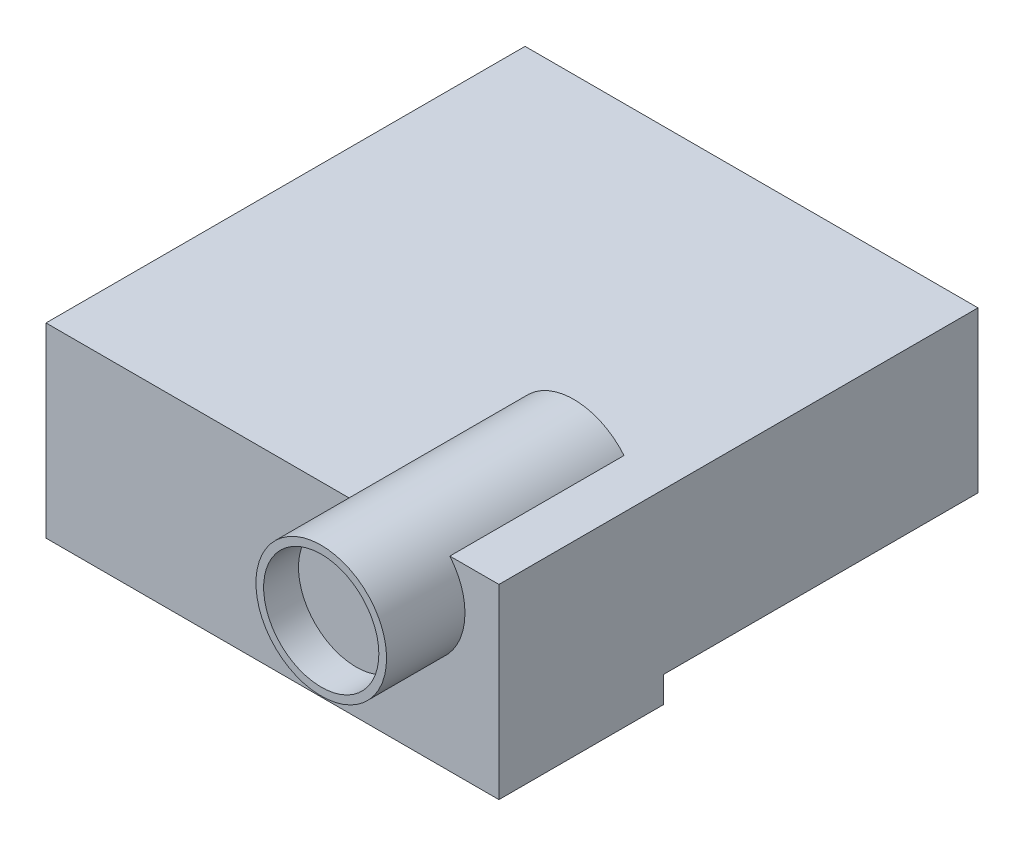
ISO-10303-21;
HEADER;
FILE_DESCRIPTION(('STEP AP214'),'2;1');
FILE_NAME('part.step','',(''),(''),'','','');
FILE_SCHEMA(('AUTOMOTIVE_DESIGN { 1 0 10303 214 1 1 1 1 }'));
ENDSEC;
DATA;
#1=APPLICATION_CONTEXT('core data for automotive mechanical design processes');
#2=APPLICATION_PROTOCOL_DEFINITION('international standard','automotive_design',2000,#1);
#3=PRODUCT_CONTEXT('',#1,'mechanical');
#4=PRODUCT('Part','Part','',(#3));
#5=PRODUCT_RELATED_PRODUCT_CATEGORY('part','',(#4));
#6=PRODUCT_DEFINITION_FORMATION('','',#4);
#7=PRODUCT_DEFINITION_CONTEXT('part definition',#1,'design');
#8=PRODUCT_DEFINITION('design','',#6,#7);
#9=PRODUCT_DEFINITION_SHAPE('','',#8);
#10=(LENGTH_UNIT() NAMED_UNIT(*) SI_UNIT(.MILLI.,.METRE.));
#11=(NAMED_UNIT(*) PLANE_ANGLE_UNIT() SI_UNIT($,.RADIAN.));
#12=(NAMED_UNIT(*) SI_UNIT($,.STERADIAN.) SOLID_ANGLE_UNIT());
#13=UNCERTAINTY_MEASURE_WITH_UNIT(LENGTH_MEASURE(1.E-05),#10,'distance_accuracy_value','');
#14=(GEOMETRIC_REPRESENTATION_CONTEXT(3) GLOBAL_UNCERTAINTY_ASSIGNED_CONTEXT((#13)) GLOBAL_UNIT_ASSIGNED_CONTEXT((#10,
#11,#12)) REPRESENTATION_CONTEXT('',''));
#15=CARTESIAN_POINT('',(0.,0.,0.));
#16=DIRECTION('',(0.,0.,1.));
#17=DIRECTION('',(1.,0.,0.));
#18=AXIS2_PLACEMENT_3D('',#15,#16,#17);
#19=CARTESIAN_POINT('',(0.,107.,0.));
#20=DIRECTION('',(1.,0.,0.));
#21=DIRECTION('',(0.,0.,-1.));
#22=AXIS2_PLACEMENT_3D('',#19,#20,#21);
#23=PLANE('',#22);
#24=DIRECTION('',(0.,0.,1.));
#25=VECTOR('',#24,1.);
#26=CARTESIAN_POINT('',(0.,15.,-275.));
#27=LINE('',#26,#25);
#28=CARTESIAN_POINT('',(0.,15.,-275.));
#29=VERTEX_POINT('',#28);
#30=CARTESIAN_POINT('',(0.,15.,-94.4841384510806));
#31=VERTEX_POINT('',#30);
#32=EDGE_CURVE('E143',#29,#31,#27,.T.);
#33=ORIENTED_EDGE('',*,*,#32,.T.);
#34=DIRECTION('',(0.,-1.,0.));
#35=VECTOR('',#34,1.);
#36=CARTESIAN_POINT('',(0.,15.,-94.4841384510806));
#37=LINE('',#36,#35);
#38=CARTESIAN_POINT('',(0.,0.,-94.4841384510806));
#39=VERTEX_POINT('',#38);
#40=EDGE_CURVE('E146',#31,#39,#37,.T.);
#41=ORIENTED_EDGE('',*,*,#40,.T.);
#42=DIRECTION('',(0.,0.,1.));
#43=VECTOR('',#42,1.);
#44=CARTESIAN_POINT('',(0.,0.,0.));
#45=LINE('',#44,#43);
#46=CARTESIAN_POINT('',(0.,0.,0.));
#47=VERTEX_POINT('',#46);
#48=EDGE_CURVE('E163',#39,#47,#45,.T.);
#49=ORIENTED_EDGE('',*,*,#48,.T.);
#50=DIRECTION('',(0.,-1.,0.));
#51=VECTOR('',#50,1.);
#52=CARTESIAN_POINT('',(0.,107.,0.));
#53=LINE('',#52,#51);
#54=CARTESIAN_POINT('',(0.,107.,0.));
#55=VERTEX_POINT('',#54);
#56=EDGE_CURVE('E190',#55,#47,#53,.T.);
#57=ORIENTED_EDGE('',*,*,#56,.F.);
#58=DIRECTION('',(0.,0.,1.));
#59=VECTOR('',#58,1.);
#60=CARTESIAN_POINT('',(0.,107.,0.));
#61=LINE('',#60,#59);
#62=CARTESIAN_POINT('',(0.,107.,-275.));
#63=VERTEX_POINT('',#62);
#64=EDGE_CURVE('E164',#63,#55,#61,.T.);
#65=ORIENTED_EDGE('',*,*,#64,.F.);
#66=DIRECTION('',(0.,-1.,0.));
#67=VECTOR('',#66,1.);
#68=CARTESIAN_POINT('',(0.,107.,-275.));
#69=LINE('',#68,#67);
#70=EDGE_CURVE('E176',#63,#29,#69,.T.);
#71=ORIENTED_EDGE('',*,*,#70,.T.);
#72=EDGE_LOOP('',(#33,#41,#49,#57,#65,#71));
#73=FACE_BOUND('',#72,.T.);
#74=ADVANCED_FACE('F38',(#73),#23,.F.);
#75=CARTESIAN_POINT('',(0.,107.,0.));
#76=DIRECTION('',(0.,0.,-1.));
#77=DIRECTION('',(-1.,0.,0.));
#78=AXIS2_PLACEMENT_3D('',#75,#76,#77);
#79=PLANE('',#78);
#80=DIRECTION('',(1.,0.,0.));
#81=VECTOR('',#80,1.);
#82=CARTESIAN_POINT('',(0.,107.,0.));
#83=LINE('',#82,#81);
#84=CARTESIAN_POINT('',(231.814059068448,107.,0.));
#85=VERTEX_POINT('',#84);
#86=CARTESIAN_POINT('',(260.,107.,0.));
#87=VERTEX_POINT('',#86);
#88=EDGE_CURVE('E167',#85,#87,#83,.T.);
#89=ORIENTED_EDGE('',*,*,#88,.F.);
#90=CARTESIAN_POINT('',(203.,83.,0.));
#91=DIRECTION('',(0.,0.,-1.));
#92=DIRECTION('',(-1.,0.,0.));
#93=AXIS2_PLACEMENT_3D('',#90,#91,#92);
#94=CIRCLE('',#93,37.5);
#95=CARTESIAN_POINT('',(174.185940931552,107.,0.));
#96=VERTEX_POINT('',#95);
#97=EDGE_CURVE('E161',#85,#96,#94,.T.);
#98=ORIENTED_EDGE('',*,*,#97,.T.);
#99=EDGE_CURVE('E169',#55,#96,#83,.T.);
#100=ORIENTED_EDGE('',*,*,#99,.F.);
#101=ORIENTED_EDGE('',*,*,#56,.T.);
#102=DIRECTION('',(1.,0.,0.));
#103=VECTOR('',#102,1.);
#104=CARTESIAN_POINT('',(0.,0.,0.));
#105=LINE('',#104,#103);
#106=CARTESIAN_POINT('',(260.,0.,0.));
#107=VERTEX_POINT('',#106);
#108=EDGE_CURVE('E178',#47,#107,#105,.T.);
#109=ORIENTED_EDGE('',*,*,#108,.T.);
#110=DIRECTION('',(0.,-1.,0.));
#111=VECTOR('',#110,1.);
#112=CARTESIAN_POINT('',(260.,107.,0.));
#113=LINE('',#112,#111);
#114=EDGE_CURVE('E187',#87,#107,#113,.T.);
#115=ORIENTED_EDGE('',*,*,#114,.F.);
#116=EDGE_LOOP('',(#89,#98,#100,#101,#109,#115));
#117=FACE_BOUND('',#116,.T.);
#118=ADVANCED_FACE('F202',(#117),#79,.F.);
#119=CARTESIAN_POINT('',(260.,107.,0.));
#120=DIRECTION('',(-1.,0.,0.));
#121=DIRECTION('',(0.,0.,1.));
#122=AXIS2_PLACEMENT_3D('',#119,#120,#121);
#123=PLANE('',#122);
#124=DIRECTION('',(0.,0.,-1.));
#125=VECTOR('',#124,1.);
#126=CARTESIAN_POINT('',(260.,0.,0.));
#127=LINE('',#126,#125);
#128=CARTESIAN_POINT('',(260.,0.,-94.4841384510806));
#129=VERTEX_POINT('',#128);
#130=EDGE_CURVE('E168',#107,#129,#127,.T.);
#131=ORIENTED_EDGE('',*,*,#130,.T.);
#132=DIRECTION('',(0.,-1.,0.));
#133=VECTOR('',#132,1.);
#134=CARTESIAN_POINT('',(260.,15.,-94.4841384510806));
#135=LINE('',#134,#133);
#136=CARTESIAN_POINT('',(260.,15.,-94.4841384510806));
#137=VERTEX_POINT('',#136);
#138=EDGE_CURVE('E52',#137,#129,#135,.T.);
#139=ORIENTED_EDGE('',*,*,#138,.F.);
#140=DIRECTION('',(0.,0.,1.));
#141=VECTOR('',#140,1.);
#142=CARTESIAN_POINT('',(260.,15.,-275.));
#143=LINE('',#142,#141);
#144=CARTESIAN_POINT('',(260.,15.,-275.));
#145=VERTEX_POINT('',#144);
#146=EDGE_CURVE('E142',#145,#137,#143,.T.);
#147=ORIENTED_EDGE('',*,*,#146,.F.);
#148=DIRECTION('',(0.,-1.,0.));
#149=VECTOR('',#148,1.);
#150=CARTESIAN_POINT('',(260.,107.,-275.));
#151=LINE('',#150,#149);
#152=CARTESIAN_POINT('',(260.,107.,-275.));
#153=VERTEX_POINT('',#152);
#154=EDGE_CURVE('E184',#153,#145,#151,.T.);
#155=ORIENTED_EDGE('',*,*,#154,.F.);
#156=DIRECTION('',(0.,0.,-1.));
#157=VECTOR('',#156,1.);
#158=CARTESIAN_POINT('',(260.,107.,0.));
#159=LINE('',#158,#157);
#160=EDGE_CURVE('E172',#87,#153,#159,.T.);
#161=ORIENTED_EDGE('',*,*,#160,.F.);
#162=ORIENTED_EDGE('',*,*,#114,.T.);
#163=EDGE_LOOP('',(#131,#139,#147,#155,#161,#162));
#164=FACE_BOUND('',#163,.T.);
#165=ADVANCED_FACE('F226',(#164),#123,.F.);
#166=CARTESIAN_POINT('',(0.,107.,-275.));
#167=DIRECTION('',(0.,0.,1.));
#168=DIRECTION('',(1.,0.,0.));
#169=AXIS2_PLACEMENT_3D('',#166,#167,#168);
#170=PLANE('',#169);
#171=ORIENTED_EDGE('',*,*,#154,.T.);
#172=DIRECTION('',(1.,0.,0.));
#173=VECTOR('',#172,1.);
#174=CARTESIAN_POINT('',(0.,15.,-275.));
#175=LINE('',#174,#173);
#176=EDGE_CURVE('E149',#29,#145,#175,.T.);
#177=ORIENTED_EDGE('',*,*,#176,.F.);
#178=ORIENTED_EDGE('',*,*,#70,.F.);
#179=DIRECTION('',(-1.,0.,0.));
#180=VECTOR('',#179,1.);
#181=CARTESIAN_POINT('',(0.,107.,-275.));
#182=LINE('',#181,#180);
#183=EDGE_CURVE('E174',#153,#63,#182,.T.);
#184=ORIENTED_EDGE('',*,*,#183,.F.);
#185=EDGE_LOOP('',(#171,#177,#178,#184));
#186=FACE_BOUND('',#185,.T.);
#187=ADVANCED_FACE('F235',(#186),#170,.F.);
#188=CARTESIAN_POINT('',(0.,107.,0.));
#189=DIRECTION('',(0.,-1.,0.));
#190=DIRECTION('',(0.,0.,-1.));
#191=AXIS2_PLACEMENT_3D('',#188,#189,#190);
#192=PLANE('',#191);
#193=DIRECTION('',(-1.,0.,0.));
#194=VECTOR('',#193,1.);
#195=CARTESIAN_POINT('',(0.,107.,-100.));
#196=LINE('',#195,#194);
#197=CARTESIAN_POINT('',(231.814059068448,107.,-100.));
#198=VERTEX_POINT('',#197);
#199=CARTESIAN_POINT('',(174.185940931552,107.,-100.));
#200=VERTEX_POINT('',#199);
#201=EDGE_CURVE('E60',#198,#200,#196,.T.);
#202=ORIENTED_EDGE('',*,*,#201,.F.);
#203=DIRECTION('',(0.,0.,1.));
#204=VECTOR('',#203,1.);
#205=CARTESIAN_POINT('',(231.814059068448,107.,-100.));
#206=LINE('',#205,#204);
#207=EDGE_CURVE('E45',#198,#85,#206,.T.);
#208=ORIENTED_EDGE('',*,*,#207,.T.);
#209=ORIENTED_EDGE('',*,*,#88,.T.);
#210=ORIENTED_EDGE('',*,*,#160,.T.);
#211=ORIENTED_EDGE('',*,*,#183,.T.);
#212=ORIENTED_EDGE('',*,*,#64,.T.);
#213=ORIENTED_EDGE('',*,*,#99,.T.);
#214=DIRECTION('',(0.,0.,1.));
#215=VECTOR('',#214,1.);
#216=CARTESIAN_POINT('',(174.185940931552,107.,-100.));
#217=LINE('',#216,#215);
#218=EDGE_CURVE('E194',#96,#200,#217,.F.);
#219=ORIENTED_EDGE('',*,*,#218,.T.);
#220=EDGE_LOOP('',(#202,#208,#209,#210,#211,#212,#213,#219));
#221=FACE_BOUND('',#220,.T.);
#222=ADVANCED_FACE('F196',(#221),#192,.F.);
#223=CARTESIAN_POINT('',(0.,0.,0.));
#224=DIRECTION('',(0.,-1.,0.));
#225=DIRECTION('',(0.,0.,-1.));
#226=AXIS2_PLACEMENT_3D('',#223,#224,#225);
#227=PLANE('',#226);
#228=CARTESIAN_POINT('',(143.933526011561,0.,-49.0555083829807));
#229=DIRECTION('',(0.,-1.,0.));
#230=DIRECTION('',(0.,0.,-1.));
#231=AXIS2_PLACEMENT_3D('',#228,#229,#230);
#232=CIRCLE('',#231,2.25);
#233=CARTESIAN_POINT('',(143.933526011561,0.,-51.3055083829807));
#234=VERTEX_POINT('',#233);
#235=EDGE_CURVE('E120',#234,#234,#232,.T.);
#236=ORIENTED_EDGE('',*,*,#235,.F.);
#237=EDGE_LOOP('',(#236));
#238=FACE_BOUND('',#237,.T.);
#239=DIRECTION('',(1.,0.,0.));
#240=VECTOR('',#239,1.);
#241=CARTESIAN_POINT('',(0.,0.,-94.4841384510806));
#242=LINE('',#241,#240);
#243=EDGE_CURVE('E153',#39,#129,#242,.T.);
#244=ORIENTED_EDGE('',*,*,#243,.T.);
#245=ORIENTED_EDGE('',*,*,#130,.F.);
#246=ORIENTED_EDGE('',*,*,#108,.F.);
#247=ORIENTED_EDGE('',*,*,#48,.F.);
#248=EDGE_LOOP('',(#244,#245,#246,#247));
#249=FACE_BOUND('',#248,.T.);
#250=ADVANCED_FACE('F218',(#238,#249),#227,.T.);
#251=CARTESIAN_POINT('',(203.,83.,-100.));
#252=DIRECTION('',(0.,0.,1.));
#253=DIRECTION('',(1.,0.,0.));
#254=AXIS2_PLACEMENT_3D('',#251,#252,#253);
#255=CYLINDRICAL_SURFACE('',#254,37.5);
#256=ORIENTED_EDGE('',*,*,#207,.F.);
#257=CARTESIAN_POINT('',(203.,83.,-100.));
#258=DIRECTION('',(0.,0.,1.));
#259=DIRECTION('',(1.,0.,0.));
#260=AXIS2_PLACEMENT_3D('',#257,#258,#259);
#261=CIRCLE('',#260,37.5);
#262=EDGE_CURVE('E155',#198,#200,#261,.T.);
#263=ORIENTED_EDGE('',*,*,#262,.T.);
#264=ORIENTED_EDGE('',*,*,#218,.F.);
#265=ORIENTED_EDGE('',*,*,#97,.F.);
#266=EDGE_LOOP('',(#256,#263,#264,#265));
#267=FACE_BOUND('',#266,.T.);
#268=CARTESIAN_POINT('',(203.,83.,45.));
#269=DIRECTION('',(0.,0.,1.));
#270=DIRECTION('',(1.,0.,0.));
#271=AXIS2_PLACEMENT_3D('',#268,#269,#270);
#272=CIRCLE('',#271,37.5);
#273=CARTESIAN_POINT('',(240.5,83.,45.));
#274=VERTEX_POINT('',#273);
#275=EDGE_CURVE('E123',#274,#274,#272,.T.);
#276=ORIENTED_EDGE('',*,*,#275,.F.);
#277=EDGE_LOOP('',(#276));
#278=FACE_BOUND('',#277,.T.);
#279=ADVANCED_FACE('F205',(#267,#278),#255,.T.);
#280=CARTESIAN_POINT('',(203.,83.,-100.));
#281=DIRECTION('',(0.,0.,1.));
#282=DIRECTION('',(1.,0.,0.));
#283=AXIS2_PLACEMENT_3D('',#280,#281,#282);
#284=PLANE('',#283);
#285=ORIENTED_EDGE('',*,*,#262,.F.);
#286=ORIENTED_EDGE('',*,*,#201,.T.);
#287=EDGE_LOOP('',(#285,#286));
#288=FACE_BOUND('',#287,.T.);
#289=ADVANCED_FACE('F208',(#288),#284,.F.);
#290=CARTESIAN_POINT('',(0.,15.,-94.4841384510806));
#291=DIRECTION('',(0.,0.,1.));
#292=DIRECTION('',(1.,0.,0.));
#293=AXIS2_PLACEMENT_3D('',#290,#291,#292);
#294=PLANE('',#293);
#295=ORIENTED_EDGE('',*,*,#138,.T.);
#296=ORIENTED_EDGE('',*,*,#243,.F.);
#297=ORIENTED_EDGE('',*,*,#40,.F.);
#298=DIRECTION('',(1.,0.,0.));
#299=VECTOR('',#298,1.);
#300=CARTESIAN_POINT('',(0.,15.,-94.4841384510806));
#301=LINE('',#300,#299);
#302=EDGE_CURVE('E156',#31,#137,#301,.T.);
#303=ORIENTED_EDGE('',*,*,#302,.T.);
#304=EDGE_LOOP('',(#295,#296,#297,#303));
#305=FACE_BOUND('',#304,.T.);
#306=ADVANCED_FACE('F210',(#305),#294,.F.);
#307=CARTESIAN_POINT('',(0.,15.,-275.));
#308=DIRECTION('',(0.,1.,0.));
#309=DIRECTION('',(0.,0.,1.));
#310=AXIS2_PLACEMENT_3D('',#307,#308,#309);
#311=PLANE('',#310);
#312=CARTESIAN_POINT('',(36.,15.,-235.));
#313=DIRECTION('',(0.,-1.,0.));
#314=DIRECTION('',(0.,0.,-1.));
#315=AXIS2_PLACEMENT_3D('',#312,#313,#314);
#316=CIRCLE('',#315,1.65);
#317=CARTESIAN_POINT('',(36.,15.,-236.65));
#318=VERTEX_POINT('',#317);
#319=EDGE_CURVE('E130',#318,#318,#316,.T.);
#320=ORIENTED_EDGE('',*,*,#319,.F.);
#321=EDGE_LOOP('',(#320));
#322=FACE_BOUND('',#321,.T.);
#323=CARTESIAN_POINT('',(209.,15.,-235.));
#324=DIRECTION('',(0.,-1.,0.));
#325=DIRECTION('',(0.,0.,-1.));
#326=AXIS2_PLACEMENT_3D('',#323,#324,#325);
#327=CIRCLE('',#326,1.64999999999998);
#328=CARTESIAN_POINT('',(209.,15.,-236.65));
#329=VERTEX_POINT('',#328);
#330=EDGE_CURVE('E136',#329,#329,#327,.T.);
#331=ORIENTED_EDGE('',*,*,#330,.F.);
#332=EDGE_LOOP('',(#331));
#333=FACE_BOUND('',#332,.T.);
#334=ORIENTED_EDGE('',*,*,#146,.T.);
#335=ORIENTED_EDGE('',*,*,#302,.F.);
#336=ORIENTED_EDGE('',*,*,#32,.F.);
#337=ORIENTED_EDGE('',*,*,#176,.T.);
#338=EDGE_LOOP('',(#334,#335,#336,#337));
#339=FACE_BOUND('',#338,.T.);
#340=ADVANCED_FACE('F216',(#322,#333,#339),#311,.F.);
#341=CARTESIAN_POINT('',(209.,26.5,-235.));
#342=DIRECTION('',(0.,-1.,0.));
#343=DIRECTION('',(0.,0.,-1.));
#344=AXIS2_PLACEMENT_3D('',#341,#342,#343);
#345=CONICAL_SURFACE('',#344,1.64999999999998,1.02974425867665);
#346=CARTESIAN_POINT('',(209.,27.4914200213955,-235.));
#347=VERTEX_POINT('',#346);
#348=VERTEX_LOOP('',#347);
#349=FACE_BOUND('',#348,.T.);
#350=CARTESIAN_POINT('',(209.,26.5,-235.));
#351=DIRECTION('',(0.,-1.,0.));
#352=DIRECTION('',(0.,0.,-1.));
#353=AXIS2_PLACEMENT_3D('',#350,#351,#352);
#354=CIRCLE('',#353,1.64999999999998);
#355=CARTESIAN_POINT('',(209.,26.5,-236.65));
#356=VERTEX_POINT('',#355);
#357=EDGE_CURVE('E139',#356,#356,#354,.T.);
#358=ORIENTED_EDGE('',*,*,#357,.T.);
#359=EDGE_LOOP('',(#358));
#360=FACE_BOUND('',#359,.T.);
#361=ADVANCED_FACE('F312',(#349,#360),#345,.F.);
#362=CARTESIAN_POINT('',(209.,15.,-235.));
#363=DIRECTION('',(0.,-1.,0.));
#364=DIRECTION('',(0.,0.,-1.));
#365=AXIS2_PLACEMENT_3D('',#362,#363,#364);
#366=CYLINDRICAL_SURFACE('',#365,1.64999999999998);
#367=ORIENTED_EDGE('',*,*,#357,.F.);
#368=EDGE_LOOP('',(#367));
#369=FACE_BOUND('',#368,.T.);
#370=ORIENTED_EDGE('',*,*,#330,.T.);
#371=EDGE_LOOP('',(#370));
#372=FACE_BOUND('',#371,.T.);
#373=ADVANCED_FACE('F321',(#369,#372),#366,.F.);
#374=CARTESIAN_POINT('',(36.,26.5,-235.));
#375=DIRECTION('',(0.,-1.,0.));
#376=DIRECTION('',(0.,0.,-1.));
#377=AXIS2_PLACEMENT_3D('',#374,#375,#376);
#378=CONICAL_SURFACE('',#377,1.65,1.02974425867665);
#379=CARTESIAN_POINT('',(36.,27.4914200213955,-235.));
#380=VERTEX_POINT('',#379);
#381=VERTEX_LOOP('',#380);
#382=FACE_BOUND('',#381,.T.);
#383=CARTESIAN_POINT('',(36.,26.5,-235.));
#384=DIRECTION('',(0.,-1.,0.));
#385=DIRECTION('',(0.,0.,-1.));
#386=AXIS2_PLACEMENT_3D('',#383,#384,#385);
#387=CIRCLE('',#386,1.65);
#388=CARTESIAN_POINT('',(36.,26.5,-236.65));
#389=VERTEX_POINT('',#388);
#390=EDGE_CURVE('E133',#389,#389,#387,.T.);
#391=ORIENTED_EDGE('',*,*,#390,.T.);
#392=EDGE_LOOP('',(#391));
#393=FACE_BOUND('',#392,.T.);
#394=ADVANCED_FACE('F330',(#382,#393),#378,.F.);
#395=CARTESIAN_POINT('',(36.,15.,-235.));
#396=DIRECTION('',(0.,-1.,0.));
#397=DIRECTION('',(0.,0.,-1.));
#398=AXIS2_PLACEMENT_3D('',#395,#396,#397);
#399=CYLINDRICAL_SURFACE('',#398,1.65);
#400=ORIENTED_EDGE('',*,*,#390,.F.);
#401=EDGE_LOOP('',(#400));
#402=FACE_BOUND('',#401,.T.);
#403=ORIENTED_EDGE('',*,*,#319,.T.);
#404=EDGE_LOOP('',(#403));
#405=FACE_BOUND('',#404,.T.);
#406=ADVANCED_FACE('F340',(#402,#405),#399,.F.);
#407=CARTESIAN_POINT('',(203.,83.,45.));
#408=DIRECTION('',(0.,0.,1.));
#409=DIRECTION('',(1.,0.,0.));
#410=AXIS2_PLACEMENT_3D('',#407,#408,#409);
#411=PLANE('',#410);
#412=ORIENTED_EDGE('',*,*,#275,.T.);
#413=EDGE_LOOP('',(#412));
#414=FACE_BOUND('',#413,.T.);
#415=CARTESIAN_POINT('',(203.,83.,45.));
#416=DIRECTION('',(0.,0.,1.));
#417=DIRECTION('',(1.,0.,0.));
#418=AXIS2_PLACEMENT_3D('',#415,#416,#417);
#419=CIRCLE('',#418,33.0673868675688);
#420=CARTESIAN_POINT('',(236.067386867569,83.,45.));
#421=VERTEX_POINT('',#420);
#422=EDGE_CURVE('E119',#421,#421,#419,.T.);
#423=ORIENTED_EDGE('',*,*,#422,.F.);
#424=EDGE_LOOP('',(#423));
#425=FACE_BOUND('',#424,.T.);
#426=ADVANCED_FACE('F348',(#414,#425),#411,.T.);
#427=CARTESIAN_POINT('',(203.,83.,45.));
#428=DIRECTION('',(0.,0.,-1.));
#429=DIRECTION('',(-1.,0.,0.));
#430=AXIS2_PLACEMENT_3D('',#427,#428,#429);
#431=CYLINDRICAL_SURFACE('',#430,33.0673868675688);
#432=ORIENTED_EDGE('',*,*,#422,.T.);
#433=EDGE_LOOP('',(#432));
#434=FACE_BOUND('',#433,.T.);
#435=CARTESIAN_POINT('',(203.,83.,25.));
#436=DIRECTION('',(0.,0.,1.));
#437=DIRECTION('',(1.,0.,0.));
#438=AXIS2_PLACEMENT_3D('',#435,#436,#437);
#439=CIRCLE('',#438,33.0673868675688);
#440=CARTESIAN_POINT('',(236.067386867569,83.,25.));
#441=VERTEX_POINT('',#440);
#442=EDGE_CURVE('E11',#441,#441,#439,.F.);
#443=ORIENTED_EDGE('',*,*,#442,.T.);
#444=EDGE_LOOP('',(#443));
#445=FACE_BOUND('',#444,.T.);
#446=ADVANCED_FACE('F299',(#434,#445),#431,.F.);
#447=CARTESIAN_POINT('',(203.,83.,25.));
#448=DIRECTION('',(0.,0.,1.));
#449=DIRECTION('',(1.,0.,0.));
#450=AXIS2_PLACEMENT_3D('',#447,#448,#449);
#451=PLANE('',#450);
#452=ORIENTED_EDGE('',*,*,#442,.F.);
#453=EDGE_LOOP('',(#452));
#454=FACE_BOUND('',#453,.T.);
#455=ADVANCED_FACE('F113',(#454),#451,.T.);
#456=CARTESIAN_POINT('',(143.933526011561,20.,-49.0555083829807));
#457=DIRECTION('',(0.,-1.,0.));
#458=DIRECTION('',(0.,0.,-1.));
#459=AXIS2_PLACEMENT_3D('',#456,#457,#458);
#460=CONICAL_SURFACE('',#459,2.25,1.02974425867665);
#461=CARTESIAN_POINT('',(143.933526011561,21.351936392812,-49.0555083829807));
#462=VERTEX_POINT('',#461);
#463=VERTEX_LOOP('',#462);
#464=FACE_BOUND('',#463,.T.);
#465=CARTESIAN_POINT('',(143.933526011561,20.,-49.0555083829807));
#466=DIRECTION('',(0.,-1.,0.));
#467=DIRECTION('',(0.,0.,-1.));
#468=AXIS2_PLACEMENT_3D('',#465,#466,#467);
#469=CIRCLE('',#468,2.25);
#470=CARTESIAN_POINT('',(143.933526011561,20.,-51.3055083829807));
#471=VERTEX_POINT('',#470);
#472=EDGE_CURVE('E117',#471,#471,#469,.T.);
#473=ORIENTED_EDGE('',*,*,#472,.T.);
#474=EDGE_LOOP('',(#473));
#475=FACE_BOUND('',#474,.T.);
#476=ADVANCED_FACE('F109',(#464,#475),#460,.F.);
#477=CARTESIAN_POINT('',(143.933526011561,0.,-49.0555083829807));
#478=DIRECTION('',(0.,-1.,0.));
#479=DIRECTION('',(0.,0.,-1.));
#480=AXIS2_PLACEMENT_3D('',#477,#478,#479);
#481=CYLINDRICAL_SURFACE('',#480,2.25);
#482=ORIENTED_EDGE('',*,*,#472,.F.);
#483=EDGE_LOOP('',(#482));
#484=FACE_BOUND('',#483,.T.);
#485=ORIENTED_EDGE('',*,*,#235,.T.);
#486=EDGE_LOOP('',(#485));
#487=FACE_BOUND('',#486,.T.);
#488=ADVANCED_FACE('F112',(#484,#487),#481,.F.);
#489=CLOSED_SHELL('',(#74,#118,#165,#187,#222,#250,#279,#289,#306,#340,#361,#373,#394,#406,#426,
#446,#455,#476,#488));
#490=MANIFOLD_SOLID_BREP('B2',#489);
#491=ADVANCED_BREP_SHAPE_REPRESENTATION('',(#18,#490),#14);
#492=SHAPE_DEFINITION_REPRESENTATION(#9,#491);
ENDSEC;
END-ISO-10303-21;
